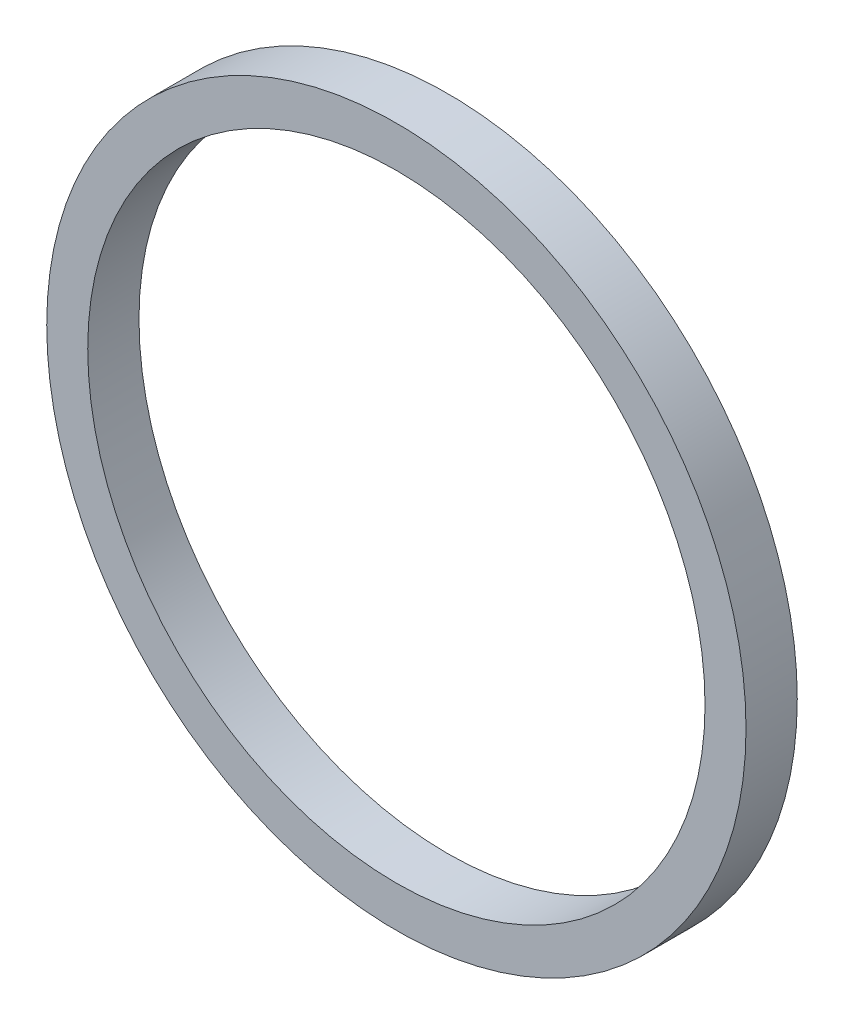
ISO-10303-21;
HEADER;
FILE_DESCRIPTION(('STEP AP214'),'2;1');
FILE_NAME('part.step','',(''),(''),'','','');
FILE_SCHEMA(('AUTOMOTIVE_DESIGN { 1 0 10303 214 1 1 1 1 }'));
ENDSEC;
DATA;
#1=APPLICATION_CONTEXT('core data for automotive mechanical design processes');
#2=APPLICATION_PROTOCOL_DEFINITION('international standard','automotive_design',2000,#1);
#3=PRODUCT_CONTEXT('',#1,'mechanical');
#4=PRODUCT('Part','Part','',(#3));
#5=PRODUCT_RELATED_PRODUCT_CATEGORY('part','',(#4));
#6=PRODUCT_DEFINITION_FORMATION('','',#4);
#7=PRODUCT_DEFINITION_CONTEXT('part definition',#1,'design');
#8=PRODUCT_DEFINITION('design','',#6,#7);
#9=PRODUCT_DEFINITION_SHAPE('','',#8);
#10=(LENGTH_UNIT() NAMED_UNIT(*) SI_UNIT(.MILLI.,.METRE.));
#11=(NAMED_UNIT(*) PLANE_ANGLE_UNIT() SI_UNIT($,.RADIAN.));
#12=(NAMED_UNIT(*) SI_UNIT($,.STERADIAN.) SOLID_ANGLE_UNIT());
#13=UNCERTAINTY_MEASURE_WITH_UNIT(LENGTH_MEASURE(1.E-05),#10,'distance_accuracy_value','');
#14=(GEOMETRIC_REPRESENTATION_CONTEXT(3) GLOBAL_UNCERTAINTY_ASSIGNED_CONTEXT((#13)) GLOBAL_UNIT_ASSIGNED_CONTEXT((#10,
#11,#12)) REPRESENTATION_CONTEXT('',''));
#15=CARTESIAN_POINT('',(0.,0.,0.));
#16=DIRECTION('',(0.,0.,1.));
#17=DIRECTION('',(1.,0.,0.));
#18=AXIS2_PLACEMENT_3D('',#15,#16,#17);
#19=CARTESIAN_POINT('',(0.,0.,-3.));
#20=DIRECTION('',(0.,0.,1.));
#21=DIRECTION('',(1.,0.,0.));
#22=AXIS2_PLACEMENT_3D('',#19,#20,#21);
#23=CYLINDRICAL_SURFACE('',#22,17.0561);
#24=CARTESIAN_POINT('',(0.,0.,-3.));
#25=DIRECTION('',(0.,0.,1.));
#26=DIRECTION('',(1.,0.,0.));
#27=AXIS2_PLACEMENT_3D('',#24,#25,#26);
#28=CIRCLE('',#27,17.0561);
#29=CARTESIAN_POINT('',(17.0561,0.,-3.));
#30=VERTEX_POINT('',#29);
#31=EDGE_CURVE('E11',#30,#30,#28,.T.);
#32=ORIENTED_EDGE('',*,*,#31,.T.);
#33=EDGE_LOOP('',(#32));
#34=FACE_BOUND('',#33,.T.);
#35=CARTESIAN_POINT('',(0.,0.,-0.5));
#36=DIRECTION('',(0.,0.,1.));
#37=DIRECTION('',(1.,0.,0.));
#38=AXIS2_PLACEMENT_3D('',#35,#36,#37);
#39=CIRCLE('',#38,17.0561);
#40=CARTESIAN_POINT('',(17.0561,0.,-0.5));
#41=VERTEX_POINT('',#40);
#42=EDGE_CURVE('E37',#41,#41,#39,.T.);
#43=ORIENTED_EDGE('',*,*,#42,.F.);
#44=EDGE_LOOP('',(#43));
#45=FACE_BOUND('',#44,.T.);
#46=ADVANCED_FACE('F33',(#34,#45),#23,.T.);
#47=CARTESIAN_POINT('',(0.,0.,-3.));
#48=DIRECTION('',(0.,0.,1.));
#49=DIRECTION('',(1.,0.,0.));
#50=AXIS2_PLACEMENT_3D('',#47,#48,#49);
#51=PLANE('',#50);
#52=CARTESIAN_POINT('',(0.,0.,-3.));
#53=DIRECTION('',(0.,0.,1.));
#54=DIRECTION('',(1.,0.,0.));
#55=AXIS2_PLACEMENT_3D('',#52,#53,#54);
#56=CIRCLE('',#55,15.0561);
#57=CARTESIAN_POINT('',(15.0561,0.,-3.));
#58=VERTEX_POINT('',#57);
#59=EDGE_CURVE('E45',#58,#58,#56,.T.);
#60=ORIENTED_EDGE('',*,*,#59,.T.);
#61=EDGE_LOOP('',(#60));
#62=FACE_BOUND('',#61,.T.);
#63=ORIENTED_EDGE('',*,*,#31,.F.);
#64=EDGE_LOOP('',(#63));
#65=FACE_BOUND('',#64,.T.);
#66=ADVANCED_FACE('F54',(#62,#65),#51,.F.);
#67=CARTESIAN_POINT('',(0.,0.,-0.5));
#68=DIRECTION('',(0.,0.,1.));
#69=DIRECTION('',(1.,0.,0.));
#70=AXIS2_PLACEMENT_3D('',#67,#68,#69);
#71=PLANE('',#70);
#72=CARTESIAN_POINT('',(0.,0.,-0.5));
#73=DIRECTION('',(0.,0.,1.));
#74=DIRECTION('',(1.,0.,0.));
#75=AXIS2_PLACEMENT_3D('',#72,#73,#74);
#76=CIRCLE('',#75,15.0561);
#77=CARTESIAN_POINT('',(15.0561,0.,-0.5));
#78=VERTEX_POINT('',#77);
#79=EDGE_CURVE('E47',#78,#78,#76,.T.);
#80=ORIENTED_EDGE('',*,*,#79,.F.);
#81=EDGE_LOOP('',(#80));
#82=FACE_BOUND('',#81,.T.);
#83=ORIENTED_EDGE('',*,*,#42,.T.);
#84=EDGE_LOOP('',(#83));
#85=FACE_BOUND('',#84,.T.);
#86=ADVANCED_FACE('F35',(#82,#85),#71,.T.);
#87=CARTESIAN_POINT('',(0.,0.,-3.));
#88=DIRECTION('',(0.,0.,1.));
#89=DIRECTION('',(1.,0.,0.));
#90=AXIS2_PLACEMENT_3D('',#87,#88,#89);
#91=CYLINDRICAL_SURFACE('',#90,15.0561);
#92=ORIENTED_EDGE('',*,*,#59,.F.);
#93=EDGE_LOOP('',(#92));
#94=FACE_BOUND('',#93,.T.);
#95=ORIENTED_EDGE('',*,*,#79,.T.);
#96=EDGE_LOOP('',(#95));
#97=FACE_BOUND('',#96,.T.);
#98=ADVANCED_FACE('F57',(#94,#97),#91,.F.);
#99=CLOSED_SHELL('',(#46,#66,#86,#98));
#100=MANIFOLD_SOLID_BREP('B2',#99);
#101=ADVANCED_BREP_SHAPE_REPRESENTATION('',(#18,#100),#14);
#102=SHAPE_DEFINITION_REPRESENTATION(#9,#101);
ENDSEC;
END-ISO-10303-21;
